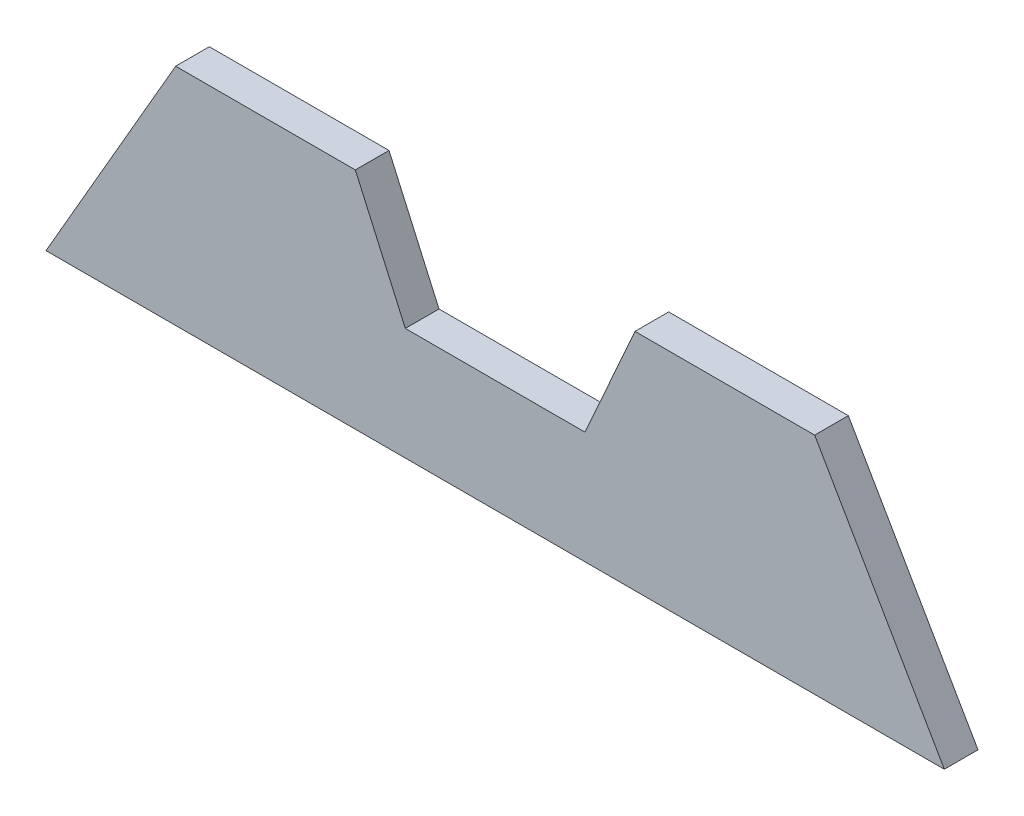
ISO-10303-21;
HEADER;
FILE_DESCRIPTION(('STEP AP214'),'2;1');
FILE_NAME('part.step','',(''),(''),'','','');
FILE_SCHEMA(('AUTOMOTIVE_DESIGN { 1 0 10303 214 1 1 1 1 }'));
ENDSEC;
DATA;
#1=APPLICATION_CONTEXT('core data for automotive mechanical design processes');
#2=APPLICATION_PROTOCOL_DEFINITION('international standard','automotive_design',2000,#1);
#3=PRODUCT_CONTEXT('',#1,'mechanical');
#4=PRODUCT('Part','Part','',(#3));
#5=PRODUCT_RELATED_PRODUCT_CATEGORY('part','',(#4));
#6=PRODUCT_DEFINITION_FORMATION('','',#4);
#7=PRODUCT_DEFINITION_CONTEXT('part definition',#1,'design');
#8=PRODUCT_DEFINITION('design','',#6,#7);
#9=PRODUCT_DEFINITION_SHAPE('','',#8);
#10=(LENGTH_UNIT() NAMED_UNIT(*) SI_UNIT(.MILLI.,.METRE.));
#11=(NAMED_UNIT(*) PLANE_ANGLE_UNIT() SI_UNIT($,.RADIAN.));
#12=(NAMED_UNIT(*) SI_UNIT($,.STERADIAN.) SOLID_ANGLE_UNIT());
#13=UNCERTAINTY_MEASURE_WITH_UNIT(LENGTH_MEASURE(1.E-05),#10,'distance_accuracy_value','');
#14=(GEOMETRIC_REPRESENTATION_CONTEXT(3) GLOBAL_UNCERTAINTY_ASSIGNED_CONTEXT((#13)) GLOBAL_UNIT_ASSIGNED_CONTEXT((#10,
#11,#12)) REPRESENTATION_CONTEXT('',''));
#15=CARTESIAN_POINT('',(0.,0.,0.));
#16=DIRECTION('',(0.,0.,1.));
#17=DIRECTION('',(1.,0.,0.));
#18=AXIS2_PLACEMENT_3D('',#15,#16,#17);
#19=CARTESIAN_POINT('',(160.,0.,3.));
#20=DIRECTION('',(0.,1.,0.));
#21=DIRECTION('',(-1.,0.,0.));
#22=AXIS2_PLACEMENT_3D('',#19,#20,#21);
#23=PLANE('',#22);
#24=DIRECTION('',(1.,0.,0.));
#25=VECTOR('',#24,1.);
#26=CARTESIAN_POINT('',(160.,0.,-3.));
#27=LINE('',#26,#25);
#28=CARTESIAN_POINT('',(0.,0.,-3.));
#29=VERTEX_POINT('',#28);
#30=CARTESIAN_POINT('',(160.,0.,-3.));
#31=VERTEX_POINT('',#30);
#32=EDGE_CURVE('E148',#29,#31,#27,.T.);
#33=ORIENTED_EDGE('',*,*,#32,.T.);
#34=DIRECTION('',(0.,0.,-1.));
#35=VECTOR('',#34,1.);
#36=CARTESIAN_POINT('',(160.,0.,3.));
#37=LINE('',#36,#35);
#38=CARTESIAN_POINT('',(160.,0.,3.));
#39=VERTEX_POINT('',#38);
#40=EDGE_CURVE('E11',#39,#31,#37,.T.);
#41=ORIENTED_EDGE('',*,*,#40,.F.);
#42=DIRECTION('',(1.,0.,0.));
#43=VECTOR('',#42,1.);
#44=CARTESIAN_POINT('',(160.,0.,3.));
#45=LINE('',#44,#43);
#46=CARTESIAN_POINT('',(0.,0.,3.));
#47=VERTEX_POINT('',#46);
#48=EDGE_CURVE('E170',#47,#39,#45,.T.);
#49=ORIENTED_EDGE('',*,*,#48,.F.);
#50=DIRECTION('',(0.,0.,-1.));
#51=VECTOR('',#50,1.);
#52=CARTESIAN_POINT('',(0.,0.,3.));
#53=LINE('',#52,#51);
#54=EDGE_CURVE('E144',#47,#29,#53,.T.);
#55=ORIENTED_EDGE('',*,*,#54,.T.);
#56=EDGE_LOOP('',(#33,#41,#49,#55));
#57=FACE_BOUND('',#56,.T.);
#58=ADVANCED_FACE('F47',(#57),#23,.F.);
#59=CARTESIAN_POINT('',(136.905989232415,40.,3.));
#60=DIRECTION('',(-0.866025403784436,-0.500000000000004,0.));
#61=DIRECTION('',(0.500000000000004,-0.866025403784436,0.));
#62=AXIS2_PLACEMENT_3D('',#59,#60,#61);
#63=PLANE('',#62);
#64=DIRECTION('',(-0.500000000000004,0.866025403784436,0.));
#65=VECTOR('',#64,1.);
#66=CARTESIAN_POINT('',(136.905989232415,40.,-3.));
#67=LINE('',#66,#65);
#68=CARTESIAN_POINT('',(136.905989232415,40.,-3.));
#69=VERTEX_POINT('',#68);
#70=EDGE_CURVE('E152',#31,#69,#67,.T.);
#71=ORIENTED_EDGE('',*,*,#70,.T.);
#72=DIRECTION('',(0.,0.,-1.));
#73=VECTOR('',#72,1.);
#74=CARTESIAN_POINT('',(136.905989232415,40.,3.));
#75=LINE('',#74,#73);
#76=CARTESIAN_POINT('',(136.905989232415,40.,3.));
#77=VERTEX_POINT('',#76);
#78=EDGE_CURVE('E56',#77,#69,#75,.T.);
#79=ORIENTED_EDGE('',*,*,#78,.F.);
#80=DIRECTION('',(-0.500000000000004,0.866025403784436,0.));
#81=VECTOR('',#80,1.);
#82=CARTESIAN_POINT('',(136.905989232415,40.,3.));
#83=LINE('',#82,#81);
#84=EDGE_CURVE('E107',#39,#77,#83,.T.);
#85=ORIENTED_EDGE('',*,*,#84,.F.);
#86=ORIENTED_EDGE('',*,*,#40,.T.);
#87=EDGE_LOOP('',(#71,#79,#85,#86));
#88=FACE_BOUND('',#87,.T.);
#89=ADVANCED_FACE('F216',(#88),#63,.F.);
#90=CARTESIAN_POINT('',(104.905989232415,40.,3.));
#91=DIRECTION('',(0.,-1.,0.));
#92=DIRECTION('',(0.,0.,-1.));
#93=AXIS2_PLACEMENT_3D('',#90,#91,#92);
#94=PLANE('',#93);
#95=DIRECTION('',(-1.,0.,0.));
#96=VECTOR('',#95,1.);
#97=CARTESIAN_POINT('',(104.905989232415,40.,-3.));
#98=LINE('',#97,#96);
#99=CARTESIAN_POINT('',(104.905989232415,40.,-3.));
#100=VERTEX_POINT('',#99);
#101=EDGE_CURVE('E155',#69,#100,#98,.T.);
#102=ORIENTED_EDGE('',*,*,#101,.T.);
#103=DIRECTION('',(0.,0.,-1.));
#104=VECTOR('',#103,1.);
#105=CARTESIAN_POINT('',(104.905989232415,40.,3.));
#106=LINE('',#105,#104);
#107=CARTESIAN_POINT('',(104.905989232415,40.,3.));
#108=VERTEX_POINT('',#107);
#109=EDGE_CURVE('E181',#108,#100,#106,.T.);
#110=ORIENTED_EDGE('',*,*,#109,.F.);
#111=DIRECTION('',(-1.,0.,0.));
#112=VECTOR('',#111,1.);
#113=CARTESIAN_POINT('',(104.905989232415,40.,3.));
#114=LINE('',#113,#112);
#115=EDGE_CURVE('E191',#77,#108,#114,.T.);
#116=ORIENTED_EDGE('',*,*,#115,.F.);
#117=ORIENTED_EDGE('',*,*,#78,.T.);
#118=EDGE_LOOP('',(#102,#110,#116,#117));
#119=FACE_BOUND('',#118,.T.);
#120=ADVANCED_FACE('F189',(#119),#94,.F.);
#121=CARTESIAN_POINT('',(96.,20.,3.));
#122=DIRECTION('',(0.913521431782728,-0.406790601751852,0.));
#123=DIRECTION('',(0.406790601751852,0.913521431782728,0.));
#124=AXIS2_PLACEMENT_3D('',#121,#122,#123);
#125=PLANE('',#124);
#126=DIRECTION('',(-0.406790601751852,-0.913521431782728,0.));
#127=VECTOR('',#126,1.);
#128=CARTESIAN_POINT('',(96.,20.,-3.));
#129=LINE('',#128,#127);
#130=CARTESIAN_POINT('',(96.,20.,-3.));
#131=VERTEX_POINT('',#130);
#132=EDGE_CURVE('E158',#100,#131,#129,.T.);
#133=ORIENTED_EDGE('',*,*,#132,.T.);
#134=DIRECTION('',(0.,0.,-1.));
#135=VECTOR('',#134,1.);
#136=CARTESIAN_POINT('',(96.,20.,3.));
#137=LINE('',#136,#135);
#138=CARTESIAN_POINT('',(96.,20.,3.));
#139=VERTEX_POINT('',#138);
#140=EDGE_CURVE('E177',#139,#131,#137,.T.);
#141=ORIENTED_EDGE('',*,*,#140,.F.);
#142=DIRECTION('',(-0.406790601751852,-0.913521431782728,0.));
#143=VECTOR('',#142,1.);
#144=CARTESIAN_POINT('',(96.,20.,3.));
#145=LINE('',#144,#143);
#146=EDGE_CURVE('E204',#108,#139,#145,.T.);
#147=ORIENTED_EDGE('',*,*,#146,.F.);
#148=ORIENTED_EDGE('',*,*,#109,.T.);
#149=EDGE_LOOP('',(#133,#141,#147,#148));
#150=FACE_BOUND('',#149,.T.);
#151=ADVANCED_FACE('F199',(#150),#125,.F.);
#152=CARTESIAN_POINT('',(64.,20.,3.));
#153=DIRECTION('',(0.,-1.,0.));
#154=DIRECTION('',(0.,0.,-1.));
#155=AXIS2_PLACEMENT_3D('',#152,#153,#154);
#156=PLANE('',#155);
#157=DIRECTION('',(-1.,0.,0.));
#158=VECTOR('',#157,1.);
#159=CARTESIAN_POINT('',(64.,20.,-3.));
#160=LINE('',#159,#158);
#161=CARTESIAN_POINT('',(64.,20.,-3.));
#162=VERTEX_POINT('',#161);
#163=EDGE_CURVE('E161',#131,#162,#160,.T.);
#164=ORIENTED_EDGE('',*,*,#163,.T.);
#165=DIRECTION('',(0.,0.,-1.));
#166=VECTOR('',#165,1.);
#167=CARTESIAN_POINT('',(64.,20.,3.));
#168=LINE('',#167,#166);
#169=CARTESIAN_POINT('',(64.,20.,3.));
#170=VERTEX_POINT('',#169);
#171=EDGE_CURVE('E137',#170,#162,#168,.T.);
#172=ORIENTED_EDGE('',*,*,#171,.F.);
#173=DIRECTION('',(-1.,0.,0.));
#174=VECTOR('',#173,1.);
#175=CARTESIAN_POINT('',(64.,20.,3.));
#176=LINE('',#175,#174);
#177=EDGE_CURVE('E126',#139,#170,#176,.T.);
#178=ORIENTED_EDGE('',*,*,#177,.F.);
#179=ORIENTED_EDGE('',*,*,#140,.T.);
#180=EDGE_LOOP('',(#164,#172,#178,#179));
#181=FACE_BOUND('',#180,.T.);
#182=ADVANCED_FACE('F202',(#181),#156,.F.);
#183=CARTESIAN_POINT('',(55.0940107675853,40.,3.));
#184=DIRECTION('',(-0.913521431782728,-0.406790601751853,0.));
#185=DIRECTION('',(0.406790601751853,-0.913521431782728,0.));
#186=AXIS2_PLACEMENT_3D('',#183,#184,#185);
#187=PLANE('',#186);
#188=DIRECTION('',(-0.406790601751853,0.913521431782728,0.));
#189=VECTOR('',#188,1.);
#190=CARTESIAN_POINT('',(55.0940107675853,40.,-3.));
#191=LINE('',#190,#189);
#192=CARTESIAN_POINT('',(55.0940107675853,40.,-3.));
#193=VERTEX_POINT('',#192);
#194=EDGE_CURVE('E135',#162,#193,#191,.T.);
#195=ORIENTED_EDGE('',*,*,#194,.T.);
#196=DIRECTION('',(0.,0.,-1.));
#197=VECTOR('',#196,1.);
#198=CARTESIAN_POINT('',(55.0940107675853,40.,3.));
#199=LINE('',#198,#197);
#200=CARTESIAN_POINT('',(55.0940107675853,40.,3.));
#201=VERTEX_POINT('',#200);
#202=EDGE_CURVE('E132',#201,#193,#199,.T.);
#203=ORIENTED_EDGE('',*,*,#202,.F.);
#204=DIRECTION('',(-0.406790601751853,0.913521431782728,0.));
#205=VECTOR('',#204,1.);
#206=CARTESIAN_POINT('',(55.0940107675853,40.,3.));
#207=LINE('',#206,#205);
#208=EDGE_CURVE('E120',#170,#201,#207,.T.);
#209=ORIENTED_EDGE('',*,*,#208,.F.);
#210=ORIENTED_EDGE('',*,*,#171,.T.);
#211=EDGE_LOOP('',(#195,#203,#209,#210));
#212=FACE_BOUND('',#211,.T.);
#213=ADVANCED_FACE('F133',(#212),#187,.F.);
#214=CARTESIAN_POINT('',(23.0940107675853,40.,3.));
#215=DIRECTION('',(0.,-1.,0.));
#216=DIRECTION('',(1.,0.,0.));
#217=AXIS2_PLACEMENT_3D('',#214,#215,#216);
#218=PLANE('',#217);
#219=DIRECTION('',(-1.,0.,0.));
#220=VECTOR('',#219,1.);
#221=CARTESIAN_POINT('',(23.0940107675853,40.,-3.));
#222=LINE('',#221,#220);
#223=CARTESIAN_POINT('',(23.0940107675853,40.,-3.));
#224=VERTEX_POINT('',#223);
#225=EDGE_CURVE('E93',#193,#224,#222,.T.);
#226=ORIENTED_EDGE('',*,*,#225,.T.);
#227=DIRECTION('',(0.,0.,-1.));
#228=VECTOR('',#227,1.);
#229=CARTESIAN_POINT('',(23.0940107675853,40.,3.));
#230=LINE('',#229,#228);
#231=CARTESIAN_POINT('',(23.0940107675853,40.,3.));
#232=VERTEX_POINT('',#231);
#233=EDGE_CURVE('E138',#232,#224,#230,.T.);
#234=ORIENTED_EDGE('',*,*,#233,.F.);
#235=DIRECTION('',(-1.,0.,0.));
#236=VECTOR('',#235,1.);
#237=CARTESIAN_POINT('',(23.0940107675853,40.,3.));
#238=LINE('',#237,#236);
#239=EDGE_CURVE('E124',#201,#232,#238,.T.);
#240=ORIENTED_EDGE('',*,*,#239,.F.);
#241=ORIENTED_EDGE('',*,*,#202,.T.);
#242=EDGE_LOOP('',(#226,#234,#240,#241));
#243=FACE_BOUND('',#242,.T.);
#244=ADVANCED_FACE('F140',(#243),#218,.F.);
#245=CARTESIAN_POINT('',(0.,0.,3.));
#246=DIRECTION('',(0.866025403784436,-0.500000000000004,0.));
#247=DIRECTION('',(0.500000000000004,0.866025403784436,0.));
#248=AXIS2_PLACEMENT_3D('',#245,#246,#247);
#249=PLANE('',#248);
#250=DIRECTION('',(-0.500000000000004,-0.866025403784436,0.));
#251=VECTOR('',#250,1.);
#252=CARTESIAN_POINT('',(0.,0.,-3.));
#253=LINE('',#252,#251);
#254=EDGE_CURVE('E99',#224,#29,#253,.T.);
#255=ORIENTED_EDGE('',*,*,#254,.T.);
#256=ORIENTED_EDGE('',*,*,#54,.F.);
#257=DIRECTION('',(-0.500000000000004,-0.866025403784436,0.));
#258=VECTOR('',#257,1.);
#259=CARTESIAN_POINT('',(0.,0.,3.));
#260=LINE('',#259,#258);
#261=EDGE_CURVE('E64',#232,#47,#260,.T.);
#262=ORIENTED_EDGE('',*,*,#261,.F.);
#263=ORIENTED_EDGE('',*,*,#233,.T.);
#264=EDGE_LOOP('',(#255,#256,#262,#263));
#265=FACE_BOUND('',#264,.T.);
#266=ADVANCED_FACE('F231',(#265),#249,.F.);
#267=CARTESIAN_POINT('',(0.,0.,3.));
#268=DIRECTION('',(0.,0.,1.));
#269=DIRECTION('',(1.,0.,0.));
#270=AXIS2_PLACEMENT_3D('',#267,#268,#269);
#271=PLANE('',#270);
#272=ORIENTED_EDGE('',*,*,#48,.T.);
#273=ORIENTED_EDGE('',*,*,#84,.T.);
#274=ORIENTED_EDGE('',*,*,#115,.T.);
#275=ORIENTED_EDGE('',*,*,#146,.T.);
#276=ORIENTED_EDGE('',*,*,#177,.T.);
#277=ORIENTED_EDGE('',*,*,#208,.T.);
#278=ORIENTED_EDGE('',*,*,#239,.T.);
#279=ORIENTED_EDGE('',*,*,#261,.T.);
#280=EDGE_LOOP('',(#272,#273,#274,#275,#276,#277,#278,#279));
#281=FACE_BOUND('',#280,.T.);
#282=ADVANCED_FACE('F122',(#281),#271,.T.);
#283=CARTESIAN_POINT('',(0.,0.,-3.));
#284=DIRECTION('',(0.,0.,1.));
#285=DIRECTION('',(1.,0.,0.));
#286=AXIS2_PLACEMENT_3D('',#283,#284,#285);
#287=PLANE('',#286);
#288=ORIENTED_EDGE('',*,*,#32,.F.);
#289=ORIENTED_EDGE('',*,*,#254,.F.);
#290=ORIENTED_EDGE('',*,*,#225,.F.);
#291=ORIENTED_EDGE('',*,*,#194,.F.);
#292=ORIENTED_EDGE('',*,*,#163,.F.);
#293=ORIENTED_EDGE('',*,*,#132,.F.);
#294=ORIENTED_EDGE('',*,*,#101,.F.);
#295=ORIENTED_EDGE('',*,*,#70,.F.);
#296=EDGE_LOOP('',(#288,#289,#290,#291,#292,#293,#294,#295));
#297=FACE_BOUND('',#296,.T.);
#298=ADVANCED_FACE('F195',(#297),#287,.F.);
#299=CLOSED_SHELL('',(#58,#89,#120,#151,#182,#213,#244,#266,#282,#298));
#300=MANIFOLD_SOLID_BREP('B2',#299);
#301=ADVANCED_BREP_SHAPE_REPRESENTATION('',(#18,#300),#14);
#302=SHAPE_DEFINITION_REPRESENTATION(#9,#301);
ENDSEC;
END-ISO-10303-21;
